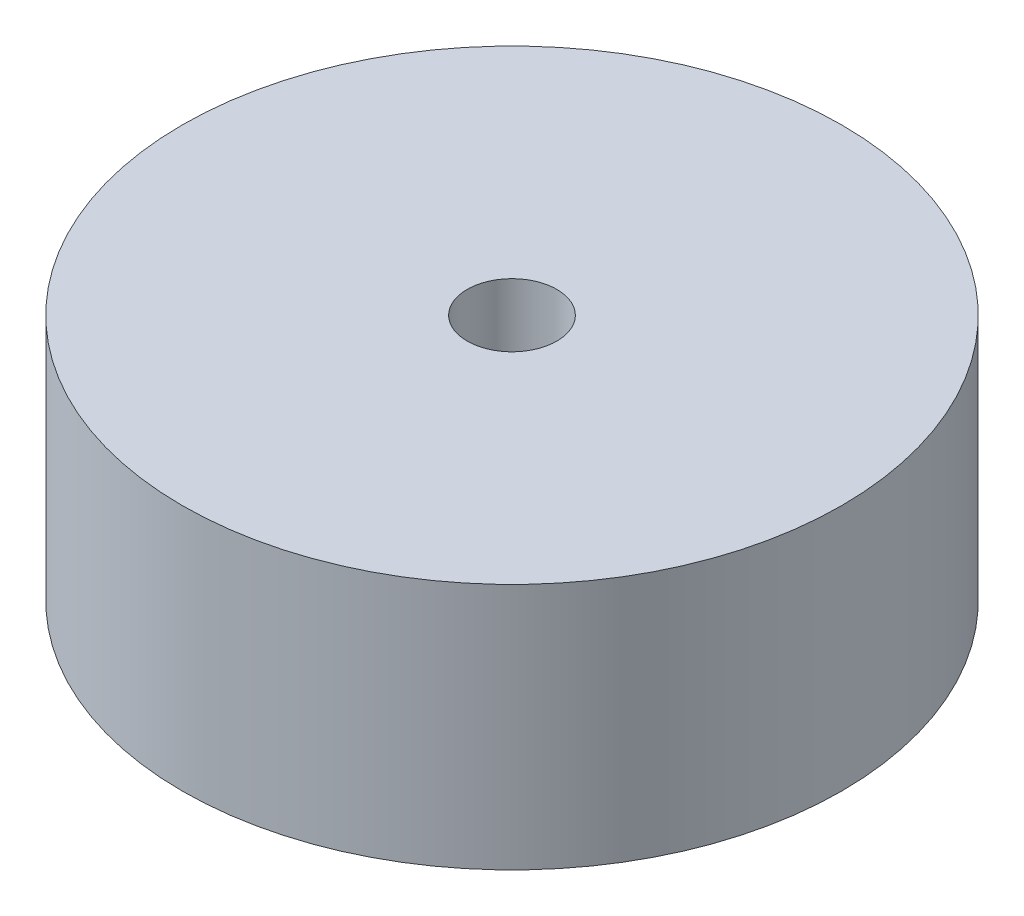
ISO-10303-21;
HEADER;
FILE_DESCRIPTION(('STEP AP214'),'2;1');
FILE_NAME('part.step','',(''),(''),'','','');
FILE_SCHEMA(('AUTOMOTIVE_DESIGN { 1 0 10303 214 1 1 1 1 }'));
ENDSEC;
DATA;
#1=APPLICATION_CONTEXT('core data for automotive mechanical design processes');
#2=APPLICATION_PROTOCOL_DEFINITION('international standard','automotive_design',2000,#1);
#3=PRODUCT_CONTEXT('',#1,'mechanical');
#4=PRODUCT('Part','Part','',(#3));
#5=PRODUCT_RELATED_PRODUCT_CATEGORY('part','',(#4));
#6=PRODUCT_DEFINITION_FORMATION('','',#4);
#7=PRODUCT_DEFINITION_CONTEXT('part definition',#1,'design');
#8=PRODUCT_DEFINITION('design','',#6,#7);
#9=PRODUCT_DEFINITION_SHAPE('','',#8);
#10=(LENGTH_UNIT() NAMED_UNIT(*) SI_UNIT(.MILLI.,.METRE.));
#11=(NAMED_UNIT(*) PLANE_ANGLE_UNIT() SI_UNIT($,.RADIAN.));
#12=(NAMED_UNIT(*) SI_UNIT($,.STERADIAN.) SOLID_ANGLE_UNIT());
#13=UNCERTAINTY_MEASURE_WITH_UNIT(LENGTH_MEASURE(1.E-05),#10,'distance_accuracy_value','');
#14=(GEOMETRIC_REPRESENTATION_CONTEXT(3) GLOBAL_UNCERTAINTY_ASSIGNED_CONTEXT((#13)) GLOBAL_UNIT_ASSIGNED_CONTEXT((#10,
#11,#12)) REPRESENTATION_CONTEXT('',''));
#15=CARTESIAN_POINT('',(0.,0.,0.));
#16=DIRECTION('',(0.,0.,1.));
#17=DIRECTION('',(1.,0.,0.));
#18=AXIS2_PLACEMENT_3D('',#15,#16,#17);
#19=CARTESIAN_POINT('',(0.,19.05,0.));
#20=DIRECTION('',(0.,-1.,0.));
#21=DIRECTION('',(0.,0.,-1.));
#22=AXIS2_PLACEMENT_3D('',#19,#20,#21);
#23=CYLINDRICAL_SURFACE('',#22,25.4);
#24=CARTESIAN_POINT('',(0.,19.05,0.));
#25=DIRECTION('',(0.,1.,0.));
#26=DIRECTION('',(0.,0.,1.));
#27=AXIS2_PLACEMENT_3D('',#24,#25,#26);
#28=CIRCLE('',#27,25.4);
#29=CARTESIAN_POINT('',(0.,19.05,-25.4));
#30=VERTEX_POINT('',#29);
#31=EDGE_CURVE('E10',#30,#30,#28,.T.);
#32=CARTESIAN_POINT('',(0.,0.,0.));
#33=DIRECTION('',(0.,1.,0.));
#34=DIRECTION('',(0.,0.,1.));
#35=AXIS2_PLACEMENT_3D('',#32,#33,#34);
#36=CIRCLE('',#35,25.4);
#37=CARTESIAN_POINT('',(0.,0.,-25.4));
#38=VERTEX_POINT('',#37);
#39=EDGE_CURVE('E37',#38,#38,#36,.T.);
#40=CARTESIAN_POINT('',(0.,19.05,-25.4));
#41=CARTESIAN_POINT('',(0.,18.8515625,-25.4));
#42=CARTESIAN_POINT('',(0.,18.653125,-25.4));
#43=CARTESIAN_POINT('',(0.,18.25625,-25.4));
#44=CARTESIAN_POINT('',(0.,18.0578125,-25.4));
#45=CARTESIAN_POINT('',(0.,17.6609375,-25.4));
#46=CARTESIAN_POINT('',(0.,17.4625,-25.4));
#47=CARTESIAN_POINT('',(0.,17.065625,-25.4));
#48=CARTESIAN_POINT('',(0.,16.8671875,-25.4));
#49=CARTESIAN_POINT('',(0.,16.4703125,-25.4));
#50=CARTESIAN_POINT('',(0.,16.271875,-25.4));
#51=CARTESIAN_POINT('',(0.,15.875,-25.4));
#52=CARTESIAN_POINT('',(0.,15.6765625,-25.4));
#53=CARTESIAN_POINT('',(0.,15.2796875,-25.4));
#54=CARTESIAN_POINT('',(0.,15.08125,-25.4));
#55=CARTESIAN_POINT('',(0.,14.684375,-25.4));
#56=CARTESIAN_POINT('',(0.,14.4859375,-25.4));
#57=CARTESIAN_POINT('',(0.,14.0890625,-25.4));
#58=CARTESIAN_POINT('',(0.,13.890625,-25.4));
#59=CARTESIAN_POINT('',(0.,13.49375,-25.4));
#60=CARTESIAN_POINT('',(0.,13.2953125,-25.4));
#61=CARTESIAN_POINT('',(0.,12.8984375,-25.4));
#62=CARTESIAN_POINT('',(0.,12.7,-25.4));
#63=CARTESIAN_POINT('',(0.,12.303125,-25.4));
#64=CARTESIAN_POINT('',(0.,12.1046875,-25.4));
#65=CARTESIAN_POINT('',(0.,11.7078125,-25.4));
#66=CARTESIAN_POINT('',(0.,11.509375,-25.4));
#67=CARTESIAN_POINT('',(0.,11.1125,-25.4));
#68=CARTESIAN_POINT('',(0.,10.9140625,-25.4));
#69=CARTESIAN_POINT('',(0.,10.5171875,-25.4));
#70=CARTESIAN_POINT('',(0.,10.31875,-25.4));
#71=CARTESIAN_POINT('',(0.,9.921875,-25.4));
#72=CARTESIAN_POINT('',(0.,9.7234375,-25.4));
#73=CARTESIAN_POINT('',(0.,9.3265625,-25.4));
#74=CARTESIAN_POINT('',(0.,9.128125,-25.4));
#75=CARTESIAN_POINT('',(0.,8.73125,-25.4));
#76=CARTESIAN_POINT('',(0.,8.5328125,-25.4));
#77=CARTESIAN_POINT('',(0.,8.1359375,-25.4));
#78=CARTESIAN_POINT('',(0.,7.9375,-25.4));
#79=CARTESIAN_POINT('',(0.,7.540625,-25.4));
#80=CARTESIAN_POINT('',(0.,7.3421875,-25.4));
#81=CARTESIAN_POINT('',(0.,6.9453125,-25.4));
#82=CARTESIAN_POINT('',(0.,6.746875,-25.4));
#83=CARTESIAN_POINT('',(0.,6.35,-25.4));
#84=CARTESIAN_POINT('',(0.,6.1515625,-25.4));
#85=CARTESIAN_POINT('',(0.,5.7546875,-25.4));
#86=CARTESIAN_POINT('',(0.,5.55625,-25.4));
#87=CARTESIAN_POINT('',(0.,5.159375,-25.4));
#88=CARTESIAN_POINT('',(0.,4.9609375,-25.4));
#89=CARTESIAN_POINT('',(0.,4.5640625,-25.4));
#90=CARTESIAN_POINT('',(0.,4.365625,-25.4));
#91=CARTESIAN_POINT('',(0.,3.96875,-25.4));
#92=CARTESIAN_POINT('',(0.,3.7703125,-25.4));
#93=CARTESIAN_POINT('',(0.,3.3734375,-25.4));
#94=CARTESIAN_POINT('',(0.,3.175,-25.4));
#95=CARTESIAN_POINT('',(0.,2.778125,-25.4));
#96=CARTESIAN_POINT('',(0.,2.5796875,-25.4));
#97=CARTESIAN_POINT('',(0.,2.1828125,-25.4));
#98=CARTESIAN_POINT('',(0.,1.984375,-25.4));
#99=CARTESIAN_POINT('',(0.,1.5875,-25.4));
#100=CARTESIAN_POINT('',(0.,1.3890625,-25.4));
#101=CARTESIAN_POINT('',(0.,0.992187500000001,-25.4));
#102=CARTESIAN_POINT('',(0.,0.793750000000001,-25.4));
#103=CARTESIAN_POINT('',(0.,0.396875,-25.4));
#104=CARTESIAN_POINT('',(0.,0.1984375,-25.4));
#105=CARTESIAN_POINT('',(0.,0.,-25.4));
#106=B_SPLINE_CURVE_WITH_KNOTS('',3,(#40,#41,#42,#43,#44,#45,#46,#47,#48,#49,#50,#51,#52,#53,
#54,#55,#56,#57,#58,#59,#60,#61,#62,#63,#64,#65,#66,#67,#68,#69,#70,#71,#72,#73,#74,#75,#76,#77,
#78,#79,#80,#81,#82,#83,#84,#85,#86,#87,#88,#89,#90,#91,#92,#93,#94,#95,#96,#97,#98,#99,#100,
#101,#102,#103,#104,#105),.UNSPECIFIED.,.F.,.F.,(4,2,2,2,2,2,2,2,2,2,2,2,2,2,2,2,2,2,2,2,2,2,2,
2,2,2,2,2,2,2,2,2,4),(0.,0.5953125,1.190625,1.7859375,2.38125,2.9765625,3.571875,4.1671875,
4.7625,5.3578125,5.953125,6.5484375,7.14375,7.7390625,8.334375,8.9296875,9.525,10.1203125,
10.715625,11.3109375,11.90625,12.5015625,13.096875,13.6921875,14.2875,14.8828125,15.478125,
16.0734375,16.66875,17.2640625,17.859375,18.4546875,19.05),.UNSPECIFIED.);
#107=EDGE_CURVE('BSEAM34',#30,#38,#106,.T.);
#108=ORIENTED_EDGE('',*,*,#31,.F.);
#109=ORIENTED_EDGE('',*,*,#39,.T.);
#110=ORIENTED_EDGE('',*,*,#107,.T.);
#111=ORIENTED_EDGE('',*,*,#107,.F.);
#112=EDGE_LOOP('',(#108,#110,#109,#111));
#113=FACE_BOUND('',#112,.T.);
#114=ADVANCED_FACE('F34',(#113),#23,.T.);
#115=CARTESIAN_POINT('',(0.,19.05,0.));
#116=DIRECTION('',(0.,1.,0.));
#117=DIRECTION('',(0.,0.,1.));
#118=AXIS2_PLACEMENT_3D('',#115,#116,#117);
#119=PLANE('',#118);
#120=CARTESIAN_POINT('',(0.,19.05,0.));
#121=DIRECTION('',(0.,1.,0.));
#122=DIRECTION('',(0.,0.,1.));
#123=AXIS2_PLACEMENT_3D('',#120,#121,#122);
#124=CIRCLE('',#123,3.4544);
#125=CARTESIAN_POINT('',(0.,19.05,3.4544));
#126=VERTEX_POINT('',#125);
#127=EDGE_CURVE('E48',#126,#126,#124,.T.);
#128=ORIENTED_EDGE('',*,*,#127,.F.);
#129=EDGE_LOOP('',(#128));
#130=FACE_BOUND('',#129,.T.);
#131=ORIENTED_EDGE('',*,*,#31,.T.);
#132=EDGE_LOOP('',(#131));
#133=FACE_BOUND('',#132,.T.);
#134=ADVANCED_FACE('F54',(#130,#133),#119,.T.);
#135=CARTESIAN_POINT('',(0.,0.,0.));
#136=DIRECTION('',(0.,1.,0.));
#137=DIRECTION('',(0.,0.,1.));
#138=AXIS2_PLACEMENT_3D('',#135,#136,#137);
#139=PLANE('',#138);
#140=CARTESIAN_POINT('',(0.,0.,0.));
#141=DIRECTION('',(0.,1.,0.));
#142=DIRECTION('',(0.,0.,1.));
#143=AXIS2_PLACEMENT_3D('',#140,#141,#142);
#144=CIRCLE('',#143,3.4544);
#145=CARTESIAN_POINT('',(0.,0.,3.4544));
#146=VERTEX_POINT('',#145);
#147=EDGE_CURVE('E44',#146,#146,#144,.T.);
#148=ORIENTED_EDGE('',*,*,#147,.T.);
#149=EDGE_LOOP('',(#148));
#150=FACE_BOUND('',#149,.T.);
#151=ORIENTED_EDGE('',*,*,#39,.F.);
#152=EDGE_LOOP('',(#151));
#153=FACE_BOUND('',#152,.T.);
#154=ADVANCED_FACE('F56',(#150,#153),#139,.F.);
#155=CARTESIAN_POINT('',(0.,19.05,0.));
#156=DIRECTION('',(0.,1.,0.));
#157=DIRECTION('',(0.,0.,1.));
#158=AXIS2_PLACEMENT_3D('',#155,#156,#157);
#159=CYLINDRICAL_SURFACE('',#158,3.4544);
#160=ORIENTED_EDGE('',*,*,#147,.F.);
#161=EDGE_LOOP('',(#160));
#162=FACE_BOUND('',#161,.T.);
#163=ORIENTED_EDGE('',*,*,#127,.T.);
#164=EDGE_LOOP('',(#163));
#165=FACE_BOUND('',#164,.T.);
#166=ADVANCED_FACE('F52',(#162,#165),#159,.F.);
#167=CLOSED_SHELL('',(#114,#134,#154,#166));
#168=MANIFOLD_SOLID_BREP('B2',#167);
#169=ADVANCED_BREP_SHAPE_REPRESENTATION('',(#18,#168),#14);
#170=SHAPE_DEFINITION_REPRESENTATION(#9,#169);
ENDSEC;
END-ISO-10303-21;
